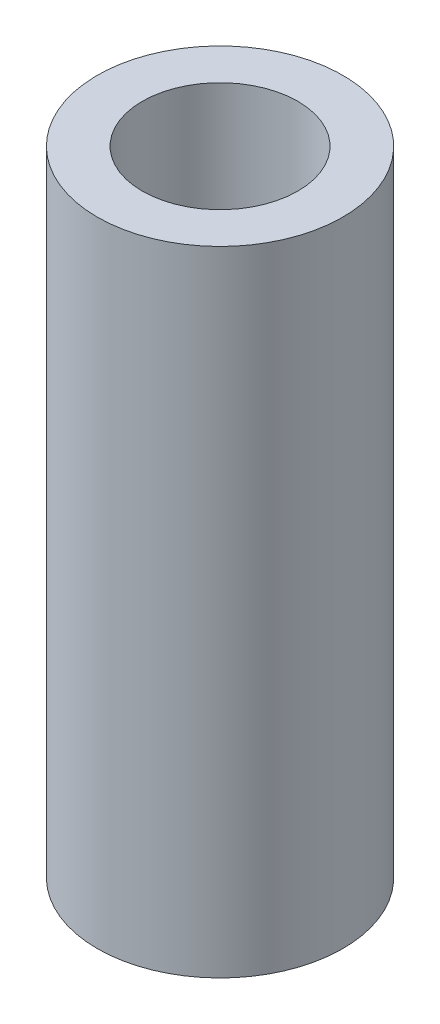
ISO-10303-21;
HEADER;
FILE_DESCRIPTION(('STEP AP214'),'2;1');
FILE_NAME('part.step','',(''),(''),'','','');
FILE_SCHEMA(('AUTOMOTIVE_DESIGN { 1 0 10303 214 1 1 1 1 }'));
ENDSEC;
DATA;
#1=APPLICATION_CONTEXT('core data for automotive mechanical design processes');
#2=APPLICATION_PROTOCOL_DEFINITION('international standard','automotive_design',2000,#1);
#3=PRODUCT_CONTEXT('',#1,'mechanical');
#4=PRODUCT('Part','Part','',(#3));
#5=PRODUCT_RELATED_PRODUCT_CATEGORY('part','',(#4));
#6=PRODUCT_DEFINITION_FORMATION('','',#4);
#7=PRODUCT_DEFINITION_CONTEXT('part definition',#1,'design');
#8=PRODUCT_DEFINITION('design','',#6,#7);
#9=PRODUCT_DEFINITION_SHAPE('','',#8);
#10=(LENGTH_UNIT() NAMED_UNIT(*) SI_UNIT(.MILLI.,.METRE.));
#11=(NAMED_UNIT(*) PLANE_ANGLE_UNIT() SI_UNIT($,.RADIAN.));
#12=(NAMED_UNIT(*) SI_UNIT($,.STERADIAN.) SOLID_ANGLE_UNIT());
#13=UNCERTAINTY_MEASURE_WITH_UNIT(LENGTH_MEASURE(1.E-05),#10,'distance_accuracy_value','');
#14=(GEOMETRIC_REPRESENTATION_CONTEXT(3) GLOBAL_UNCERTAINTY_ASSIGNED_CONTEXT((#13)) GLOBAL_UNIT_ASSIGNED_CONTEXT((#10,
#11,#12)) REPRESENTATION_CONTEXT('',''));
#15=CARTESIAN_POINT('',(0.,0.,0.));
#16=DIRECTION('',(0.,0.,1.));
#17=DIRECTION('',(1.,0.,0.));
#18=AXIS2_PLACEMENT_3D('',#15,#16,#17);
#19=CARTESIAN_POINT('',(0.,64.05,0.));
#20=DIRECTION('',(0.,-1.,0.));
#21=DIRECTION('',(0.,0.,-1.));
#22=AXIS2_PLACEMENT_3D('',#19,#20,#21);
#23=CYLINDRICAL_SURFACE('',#22,12.415);
#24=CARTESIAN_POINT('',(0.,64.05,0.));
#25=DIRECTION('',(0.,1.,0.));
#26=DIRECTION('',(0.,0.,1.));
#27=AXIS2_PLACEMENT_3D('',#24,#25,#26);
#28=CIRCLE('',#27,12.415);
#29=CARTESIAN_POINT('',(0.,64.05,12.415));
#30=VERTEX_POINT('',#29);
#31=EDGE_CURVE('E10',#30,#30,#28,.T.);
#32=ORIENTED_EDGE('',*,*,#31,.F.);
#33=EDGE_LOOP('',(#32));
#34=FACE_BOUND('',#33,.T.);
#35=CARTESIAN_POINT('',(0.,0.,0.));
#36=DIRECTION('',(0.,1.,0.));
#37=DIRECTION('',(0.,0.,1.));
#38=AXIS2_PLACEMENT_3D('',#35,#36,#37);
#39=CIRCLE('',#38,12.415);
#40=CARTESIAN_POINT('',(0.,0.,12.415));
#41=VERTEX_POINT('',#40);
#42=EDGE_CURVE('E33',#41,#41,#39,.T.);
#43=ORIENTED_EDGE('',*,*,#42,.T.);
#44=EDGE_LOOP('',(#43));
#45=FACE_BOUND('',#44,.T.);
#46=ADVANCED_FACE('F30',(#34,#45),#23,.T.);
#47=CARTESIAN_POINT('',(0.,64.05,0.));
#48=DIRECTION('',(0.,1.,0.));
#49=DIRECTION('',(0.,0.,1.));
#50=AXIS2_PLACEMENT_3D('',#47,#48,#49);
#51=PLANE('',#50);
#52=CARTESIAN_POINT('',(0.,64.05,0.));
#53=DIRECTION('',(0.,1.,0.));
#54=DIRECTION('',(0.,0.,1.));
#55=AXIS2_PLACEMENT_3D('',#52,#53,#54);
#56=CIRCLE('',#55,7.865);
#57=CARTESIAN_POINT('',(0.,64.05,7.865));
#58=VERTEX_POINT('',#57);
#59=EDGE_CURVE('E42',#58,#58,#56,.T.);
#60=ORIENTED_EDGE('',*,*,#59,.F.);
#61=EDGE_LOOP('',(#60));
#62=FACE_BOUND('',#61,.T.);
#63=ORIENTED_EDGE('',*,*,#31,.T.);
#64=EDGE_LOOP('',(#63));
#65=FACE_BOUND('',#64,.T.);
#66=ADVANCED_FACE('F57',(#62,#65),#51,.T.);
#67=CARTESIAN_POINT('',(0.,0.,0.));
#68=DIRECTION('',(0.,1.,0.));
#69=DIRECTION('',(0.,0.,1.));
#70=AXIS2_PLACEMENT_3D('',#67,#68,#69);
#71=PLANE('',#70);
#72=CARTESIAN_POINT('',(0.,0.,0.));
#73=DIRECTION('',(0.,1.,0.));
#74=DIRECTION('',(0.,0.,1.));
#75=AXIS2_PLACEMENT_3D('',#72,#73,#74);
#76=CIRCLE('',#75,7.865);
#77=CARTESIAN_POINT('',(0.,0.,7.865));
#78=VERTEX_POINT('',#77);
#79=EDGE_CURVE('E40',#78,#78,#76,.T.);
#80=ORIENTED_EDGE('',*,*,#79,.T.);
#81=EDGE_LOOP('',(#80));
#82=FACE_BOUND('',#81,.T.);
#83=ORIENTED_EDGE('',*,*,#42,.F.);
#84=EDGE_LOOP('',(#83));
#85=FACE_BOUND('',#84,.T.);
#86=ADVANCED_FACE('F48',(#82,#85),#71,.F.);
#87=CARTESIAN_POINT('',(0.,0.,0.));
#88=DIRECTION('',(0.,1.,0.));
#89=DIRECTION('',(0.,0.,1.));
#90=AXIS2_PLACEMENT_3D('',#87,#88,#89);
#91=CYLINDRICAL_SURFACE('',#90,7.865);
#92=ORIENTED_EDGE('',*,*,#79,.F.);
#93=EDGE_LOOP('',(#92));
#94=FACE_BOUND('',#93,.T.);
#95=ORIENTED_EDGE('',*,*,#59,.T.);
#96=EDGE_LOOP('',(#95));
#97=FACE_BOUND('',#96,.T.);
#98=ADVANCED_FACE('F51',(#94,#97),#91,.F.);
#99=CLOSED_SHELL('',(#46,#66,#86,#98));
#100=MANIFOLD_SOLID_BREP('B2',#99);
#101=ADVANCED_BREP_SHAPE_REPRESENTATION('',(#18,#100),#14);
#102=SHAPE_DEFINITION_REPRESENTATION(#9,#101);
ENDSEC;
END-ISO-10303-21;
